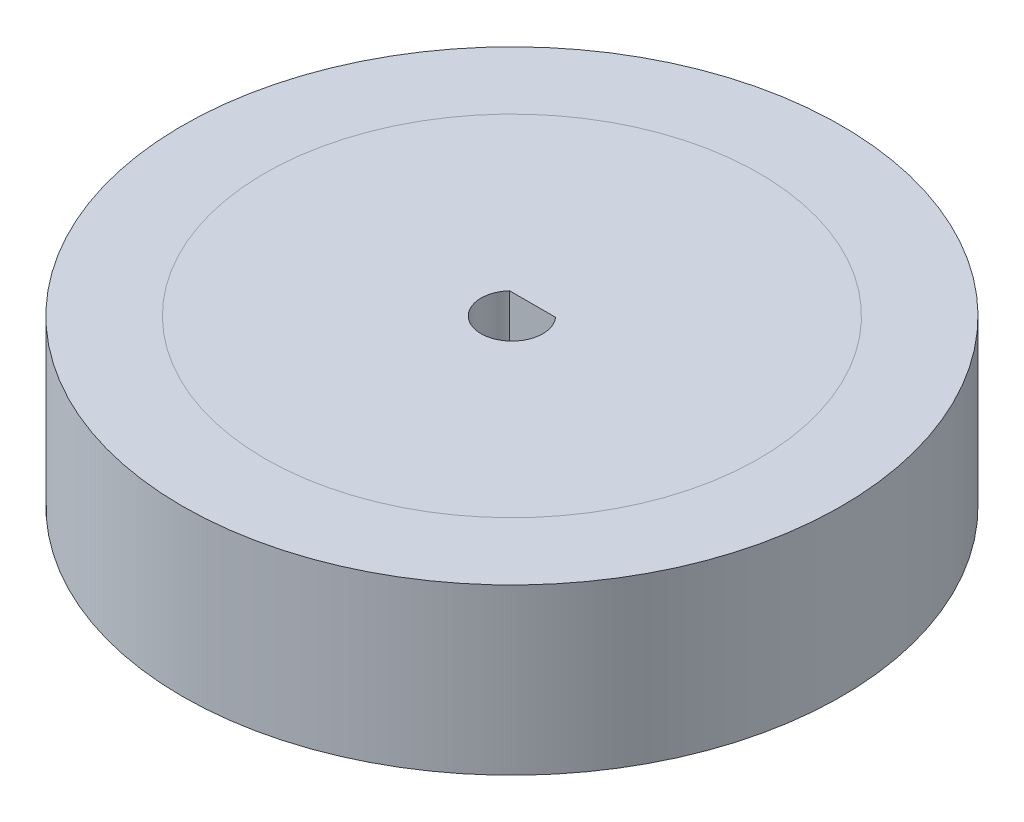
ISO-10303-21;
HEADER;
FILE_DESCRIPTION(('STEP AP214'),'2;1');
FILE_NAME('part.step','',(''),(''),'','','');
FILE_SCHEMA(('AUTOMOTIVE_DESIGN { 1 0 10303 214 1 1 1 1 }'));
ENDSEC;
DATA;
#1=APPLICATION_CONTEXT('core data for automotive mechanical design processes');
#2=APPLICATION_PROTOCOL_DEFINITION('international standard','automotive_design',2000,#1);
#3=PRODUCT_CONTEXT('',#1,'mechanical');
#4=PRODUCT('Part','Part','',(#3));
#5=PRODUCT_RELATED_PRODUCT_CATEGORY('part','',(#4));
#6=PRODUCT_DEFINITION_FORMATION('','',#4);
#7=PRODUCT_DEFINITION_CONTEXT('part definition',#1,'design');
#8=PRODUCT_DEFINITION('design','',#6,#7);
#9=PRODUCT_DEFINITION_SHAPE('','',#8);
#10=(LENGTH_UNIT() NAMED_UNIT(*) SI_UNIT(.MILLI.,.METRE.));
#11=(NAMED_UNIT(*) PLANE_ANGLE_UNIT() SI_UNIT($,.RADIAN.));
#12=(NAMED_UNIT(*) SI_UNIT($,.STERADIAN.) SOLID_ANGLE_UNIT());
#13=UNCERTAINTY_MEASURE_WITH_UNIT(LENGTH_MEASURE(1.E-05),#10,'distance_accuracy_value','');
#14=(GEOMETRIC_REPRESENTATION_CONTEXT(3) GLOBAL_UNCERTAINTY_ASSIGNED_CONTEXT((#13)) GLOBAL_UNIT_ASSIGNED_CONTEXT((#10,
#11,#12)) REPRESENTATION_CONTEXT('',''));
#15=CARTESIAN_POINT('',(0.,0.,0.));
#16=DIRECTION('',(0.,0.,1.));
#17=DIRECTION('',(1.,0.,0.));
#18=AXIS2_PLACEMENT_3D('',#15,#16,#17);
#19=CARTESIAN_POINT('',(0.,-45.254833995939,0.));
#20=DIRECTION('',(0.,1.,0.));
#21=DIRECTION('',(0.,0.,1.));
#22=AXIS2_PLACEMENT_3D('',#19,#20,#21);
#23=CYLINDRICAL_SURFACE('',#22,16.);
#24=CARTESIAN_POINT('',(0.,0.,0.));
#25=DIRECTION('',(0.,1.,0.));
#26=DIRECTION('',(0.,0.,1.));
#27=AXIS2_PLACEMENT_3D('',#24,#25,#26);
#28=CIRCLE('',#27,16.);
#29=CARTESIAN_POINT('',(0.,0.,16.));
#30=VERTEX_POINT('',#29);
#31=EDGE_CURVE('E11',#30,#30,#28,.F.);
#32=CARTESIAN_POINT('',(0.,8.,0.));
#33=DIRECTION('',(0.,1.,0.));
#34=DIRECTION('',(0.,0.,1.));
#35=AXIS2_PLACEMENT_3D('',#32,#33,#34);
#36=CIRCLE('',#35,16.);
#37=CARTESIAN_POINT('',(0.,7.99999999999999,16.));
#38=VERTEX_POINT('',#37);
#39=EDGE_CURVE('E60',#38,#38,#36,.T.);
#40=CARTESIAN_POINT('',(0.,0.,16.));
#41=CARTESIAN_POINT('',(0.,0.0833333333333333,16.));
#42=CARTESIAN_POINT('',(0.,0.166666666666667,16.));
#43=CARTESIAN_POINT('',(0.,0.333333333333334,16.));
#44=CARTESIAN_POINT('',(0.,0.416666666666667,16.));
#45=CARTESIAN_POINT('',(0.,0.583333333333334,16.));
#46=CARTESIAN_POINT('',(0.,0.666666666666667,16.));
#47=CARTESIAN_POINT('',(0.,0.833333333333334,16.));
#48=CARTESIAN_POINT('',(0.,0.916666666666668,16.));
#49=CARTESIAN_POINT('',(0.,1.08333333333333,16.));
#50=CARTESIAN_POINT('',(0.,1.16666666666667,16.));
#51=CARTESIAN_POINT('',(0.,1.33333333333333,16.));
#52=CARTESIAN_POINT('',(0.,1.41666666666667,16.));
#53=CARTESIAN_POINT('',(0.,1.58333333333333,16.));
#54=CARTESIAN_POINT('',(0.,1.66666666666667,16.));
#55=CARTESIAN_POINT('',(0.,1.83333333333334,16.));
#56=CARTESIAN_POINT('',(0.,1.91666666666667,16.));
#57=CARTESIAN_POINT('',(0.,2.08333333333333,16.));
#58=CARTESIAN_POINT('',(0.,2.16666666666666,16.));
#59=CARTESIAN_POINT('',(0.,2.33333333333333,16.));
#60=CARTESIAN_POINT('',(0.,2.41666666666666,16.));
#61=CARTESIAN_POINT('',(0.,2.58333333333333,16.));
#62=CARTESIAN_POINT('',(0.,2.66666666666666,16.));
#63=CARTESIAN_POINT('',(0.,2.83333333333333,16.));
#64=CARTESIAN_POINT('',(0.,2.91666666666666,16.));
#65=CARTESIAN_POINT('',(0.,3.08333333333333,16.));
#66=CARTESIAN_POINT('',(0.,3.16666666666666,16.));
#67=CARTESIAN_POINT('',(0.,3.33333333333333,16.));
#68=CARTESIAN_POINT('',(0.,3.41666666666666,16.));
#69=CARTESIAN_POINT('',(0.,3.58333333333333,16.));
#70=CARTESIAN_POINT('',(0.,3.66666666666666,16.));
#71=CARTESIAN_POINT('',(0.,3.83333333333333,16.));
#72=CARTESIAN_POINT('',(0.,3.91666666666666,16.));
#73=CARTESIAN_POINT('',(0.,4.08333333333333,16.));
#74=CARTESIAN_POINT('',(0.,4.16666666666666,16.));
#75=CARTESIAN_POINT('',(0.,4.33333333333333,16.));
#76=CARTESIAN_POINT('',(0.,4.41666666666666,16.));
#77=CARTESIAN_POINT('',(0.,4.58333333333333,16.));
#78=CARTESIAN_POINT('',(0.,4.66666666666666,16.));
#79=CARTESIAN_POINT('',(0.,4.83333333333333,16.));
#80=CARTESIAN_POINT('',(0.,4.91666666666666,16.));
#81=CARTESIAN_POINT('',(0.,5.08333333333333,16.));
#82=CARTESIAN_POINT('',(0.,5.16666666666666,16.));
#83=CARTESIAN_POINT('',(0.,5.33333333333333,16.));
#84=CARTESIAN_POINT('',(0.,5.41666666666666,16.));
#85=CARTESIAN_POINT('',(0.,5.58333333333333,16.));
#86=CARTESIAN_POINT('',(0.,5.66666666666666,16.));
#87=CARTESIAN_POINT('',(0.,5.83333333333333,16.));
#88=CARTESIAN_POINT('',(0.,5.91666666666666,16.));
#89=CARTESIAN_POINT('',(0.,6.08333333333333,16.));
#90=CARTESIAN_POINT('',(0.,6.16666666666666,16.));
#91=CARTESIAN_POINT('',(0.,6.33333333333333,16.));
#92=CARTESIAN_POINT('',(0.,6.41666666666666,16.));
#93=CARTESIAN_POINT('',(0.,6.58333333333333,16.));
#94=CARTESIAN_POINT('',(0.,6.66666666666666,16.));
#95=CARTESIAN_POINT('',(0.,6.83333333333333,16.));
#96=CARTESIAN_POINT('',(0.,6.91666666666666,16.));
#97=CARTESIAN_POINT('',(0.,7.08333333333333,16.));
#98=CARTESIAN_POINT('',(0.,7.16666666666666,16.));
#99=CARTESIAN_POINT('',(0.,7.33333333333333,16.));
#100=CARTESIAN_POINT('',(0.,7.41666666666666,16.));
#101=CARTESIAN_POINT('',(0.,7.58333333333333,16.));
#102=CARTESIAN_POINT('',(0.,7.66666666666666,16.));
#103=CARTESIAN_POINT('',(0.,7.83333333333333,16.));
#104=CARTESIAN_POINT('',(0.,7.91666666666666,16.));
#105=CARTESIAN_POINT('',(0.,7.99999999999999,16.));
#106=B_SPLINE_CURVE_WITH_KNOTS('',3,(#40,#41,#42,#43,#44,#45,#46,#47,#48,#49,#50,#51,#52,#53,
#54,#55,#56,#57,#58,#59,#60,#61,#62,#63,#64,#65,#66,#67,#68,#69,#70,#71,#72,#73,#74,#75,#76,#77,
#78,#79,#80,#81,#82,#83,#84,#85,#86,#87,#88,#89,#90,#91,#92,#93,#94,#95,#96,#97,#98,#99,#100,
#101,#102,#103,#104,#105),.UNSPECIFIED.,.F.,.F.,(4,2,2,2,2,2,2,2,2,2,2,2,2,2,2,2,2,2,2,2,2,2,2,
2,2,2,2,2,2,2,2,2,4),(0.,0.25,0.5,0.750000000000001,1.,1.25,1.5,1.75,2.,2.25,2.5,2.75,3.,3.25,
3.5,3.75,4.,4.25,4.5,4.75,5.,5.25,5.5,5.74999999999999,5.99999999999999,6.24999999999999,
6.49999999999999,6.74999999999999,6.99999999999999,7.24999999999999,7.49999999999999,
7.74999999999999,7.99999999999999),.UNSPECIFIED.);
#107=EDGE_CURVE('BSEAM49',#30,#38,#106,.T.);
#108=ORIENTED_EDGE('',*,*,#31,.F.);
#109=ORIENTED_EDGE('',*,*,#39,.F.);
#110=ORIENTED_EDGE('',*,*,#107,.T.);
#111=ORIENTED_EDGE('',*,*,#107,.F.);
#112=EDGE_LOOP('',(#108,#110,#109,#111));
#113=FACE_BOUND('',#112,.T.);
#114=ADVANCED_FACE('F49',(#113),#23,.T.);
#115=CARTESIAN_POINT('',(0.,8.,0.));
#116=DIRECTION('',(0.,1.,0.));
#117=DIRECTION('',(0.,0.,1.));
#118=AXIS2_PLACEMENT_3D('',#115,#116,#117);
#119=PLANE('',#118);
#120=CARTESIAN_POINT('',(0.,8.,0.));
#121=DIRECTION('',(0.,1.,0.));
#122=DIRECTION('',(0.,0.,1.));
#123=AXIS2_PLACEMENT_3D('',#120,#121,#122);
#124=CIRCLE('',#123,12.);
#125=CARTESIAN_POINT('',(0.,7.99999999999999,12.));
#126=VERTEX_POINT('',#125);
#127=EDGE_CURVE('E62',#126,#126,#124,.T.);
#128=ORIENTED_EDGE('',*,*,#127,.F.);
#129=EDGE_LOOP('',(#128));
#130=FACE_BOUND('',#129,.T.);
#131=ORIENTED_EDGE('',*,*,#39,.T.);
#132=EDGE_LOOP('',(#131));
#133=FACE_BOUND('',#132,.T.);
#134=ADVANCED_FACE('F67',(#130,#133),#119,.T.);
#135=CARTESIAN_POINT('',(0.,-45.254833995939,0.));
#136=DIRECTION('',(0.,1.,0.));
#137=DIRECTION('',(0.,0.,1.));
#138=AXIS2_PLACEMENT_3D('',#135,#136,#137);
#139=CYLINDRICAL_SURFACE('',#138,12.);
#140=CARTESIAN_POINT('',(0.,0.,0.));
#141=DIRECTION('',(0.,1.,0.));
#142=DIRECTION('',(0.,0.,1.));
#143=AXIS2_PLACEMENT_3D('',#140,#141,#142);
#144=CIRCLE('',#143,12.);
#145=CARTESIAN_POINT('',(0.,0.,12.));
#146=VERTEX_POINT('',#145);
#147=EDGE_CURVE('E52',#146,#146,#144,.F.);
#148=CARTESIAN_POINT('',(0.,0.,12.));
#149=CARTESIAN_POINT('',(0.,0.0833333333333333,12.));
#150=CARTESIAN_POINT('',(0.,0.166666666666667,12.));
#151=CARTESIAN_POINT('',(0.,0.333333333333334,12.));
#152=CARTESIAN_POINT('',(0.,0.416666666666667,12.));
#153=CARTESIAN_POINT('',(0.,0.583333333333334,12.));
#154=CARTESIAN_POINT('',(0.,0.666666666666667,12.));
#155=CARTESIAN_POINT('',(0.,0.833333333333334,12.));
#156=CARTESIAN_POINT('',(0.,0.916666666666668,12.));
#157=CARTESIAN_POINT('',(0.,1.08333333333333,12.));
#158=CARTESIAN_POINT('',(0.,1.16666666666667,12.));
#159=CARTESIAN_POINT('',(0.,1.33333333333333,12.));
#160=CARTESIAN_POINT('',(0.,1.41666666666667,12.));
#161=CARTESIAN_POINT('',(0.,1.58333333333333,12.));
#162=CARTESIAN_POINT('',(0.,1.66666666666667,12.));
#163=CARTESIAN_POINT('',(0.,1.83333333333334,12.));
#164=CARTESIAN_POINT('',(0.,1.91666666666667,12.));
#165=CARTESIAN_POINT('',(0.,2.08333333333333,12.));
#166=CARTESIAN_POINT('',(0.,2.16666666666666,12.));
#167=CARTESIAN_POINT('',(0.,2.33333333333333,12.));
#168=CARTESIAN_POINT('',(0.,2.41666666666666,12.));
#169=CARTESIAN_POINT('',(0.,2.58333333333333,12.));
#170=CARTESIAN_POINT('',(0.,2.66666666666666,12.));
#171=CARTESIAN_POINT('',(0.,2.83333333333333,12.));
#172=CARTESIAN_POINT('',(0.,2.91666666666666,12.));
#173=CARTESIAN_POINT('',(0.,3.08333333333333,12.));
#174=CARTESIAN_POINT('',(0.,3.16666666666666,12.));
#175=CARTESIAN_POINT('',(0.,3.33333333333333,12.));
#176=CARTESIAN_POINT('',(0.,3.41666666666666,12.));
#177=CARTESIAN_POINT('',(0.,3.58333333333333,12.));
#178=CARTESIAN_POINT('',(0.,3.66666666666666,12.));
#179=CARTESIAN_POINT('',(0.,3.83333333333333,12.));
#180=CARTESIAN_POINT('',(0.,3.91666666666666,12.));
#181=CARTESIAN_POINT('',(0.,4.08333333333333,12.));
#182=CARTESIAN_POINT('',(0.,4.16666666666666,12.));
#183=CARTESIAN_POINT('',(0.,4.33333333333333,12.));
#184=CARTESIAN_POINT('',(0.,4.41666666666666,12.));
#185=CARTESIAN_POINT('',(0.,4.58333333333333,12.));
#186=CARTESIAN_POINT('',(0.,4.66666666666666,12.));
#187=CARTESIAN_POINT('',(0.,4.83333333333333,12.));
#188=CARTESIAN_POINT('',(0.,4.91666666666666,12.));
#189=CARTESIAN_POINT('',(0.,5.08333333333333,12.));
#190=CARTESIAN_POINT('',(0.,5.16666666666666,12.));
#191=CARTESIAN_POINT('',(0.,5.33333333333333,12.));
#192=CARTESIAN_POINT('',(0.,5.41666666666666,12.));
#193=CARTESIAN_POINT('',(0.,5.58333333333333,12.));
#194=CARTESIAN_POINT('',(0.,5.66666666666666,12.));
#195=CARTESIAN_POINT('',(0.,5.83333333333333,12.));
#196=CARTESIAN_POINT('',(0.,5.91666666666666,12.));
#197=CARTESIAN_POINT('',(0.,6.08333333333333,12.));
#198=CARTESIAN_POINT('',(0.,6.16666666666666,12.));
#199=CARTESIAN_POINT('',(0.,6.33333333333333,12.));
#200=CARTESIAN_POINT('',(0.,6.41666666666666,12.));
#201=CARTESIAN_POINT('',(0.,6.58333333333333,12.));
#202=CARTESIAN_POINT('',(0.,6.66666666666666,12.));
#203=CARTESIAN_POINT('',(0.,6.83333333333333,12.));
#204=CARTESIAN_POINT('',(0.,6.91666666666666,12.));
#205=CARTESIAN_POINT('',(0.,7.08333333333333,12.));
#206=CARTESIAN_POINT('',(0.,7.16666666666666,12.));
#207=CARTESIAN_POINT('',(0.,7.33333333333333,12.));
#208=CARTESIAN_POINT('',(0.,7.41666666666666,12.));
#209=CARTESIAN_POINT('',(0.,7.58333333333333,12.));
#210=CARTESIAN_POINT('',(0.,7.66666666666666,12.));
#211=CARTESIAN_POINT('',(0.,7.83333333333333,12.));
#212=CARTESIAN_POINT('',(0.,7.91666666666666,12.));
#213=CARTESIAN_POINT('',(0.,7.99999999999999,12.));
#214=B_SPLINE_CURVE_WITH_KNOTS('',3,(#148,#149,#150,#151,#152,#153,#154,#155,#156,#157,#158,
#159,#160,#161,#162,#163,#164,#165,#166,#167,#168,#169,#170,#171,#172,#173,#174,#175,#176,#177,
#178,#179,#180,#181,#182,#183,#184,#185,#186,#187,#188,#189,#190,#191,#192,#193,#194,#195,#196,
#197,#198,#199,#200,#201,#202,#203,#204,#205,#206,#207,#208,#209,#210,#211,#212,#213),
.UNSPECIFIED.,.F.,.F.,(4,2,2,2,2,2,2,2,2,2,2,2,2,2,2,2,2,2,2,2,2,2,2,2,2,2,2,2,2,2,2,2,4),(0.,
0.25,0.5,0.750000000000001,1.,1.25,1.5,1.75,2.,2.25,2.5,2.75,3.,3.25,3.5,3.75,4.,4.25,4.5,4.75,
5.,5.25,5.5,5.74999999999999,5.99999999999999,6.24999999999999,6.49999999999999,
6.74999999999999,6.99999999999999,7.24999999999999,7.49999999999999,7.74999999999999,
7.99999999999999),.UNSPECIFIED.);
#215=EDGE_CURVE('BSEAM74',#146,#126,#214,.T.);
#216=ORIENTED_EDGE('',*,*,#147,.T.);
#217=ORIENTED_EDGE('',*,*,#127,.T.);
#218=ORIENTED_EDGE('',*,*,#215,.T.);
#219=ORIENTED_EDGE('',*,*,#215,.F.);
#220=EDGE_LOOP('',(#216,#218,#217,#219));
#221=FACE_BOUND('',#220,.T.);
#222=ADVANCED_FACE('F74',(#221),#139,.F.);
#223=CARTESIAN_POINT('',(0.,0.,0.));
#224=DIRECTION('',(0.,1.,0.));
#225=DIRECTION('',(0.,0.,1.));
#226=AXIS2_PLACEMENT_3D('',#223,#224,#225);
#227=PLANE('',#226);
#228=ORIENTED_EDGE('',*,*,#31,.T.);
#229=EDGE_LOOP('',(#228));
#230=FACE_BOUND('',#229,.T.);
#231=ORIENTED_EDGE('',*,*,#147,.F.);
#232=EDGE_LOOP('',(#231));
#233=FACE_BOUND('',#232,.T.);
#234=ADVANCED_FACE('F79',(#230,#233),#227,.F.);
#235=CLOSED_SHELL('',(#114,#134,#222,#234));
#236=MANIFOLD_SOLID_BREP('B2',#235);
#237=CARTESIAN_POINT('',(0.,8.,0.));
#238=DIRECTION('',(0.,1.,0.));
#239=DIRECTION('',(0.,0.,1.));
#240=AXIS2_PLACEMENT_3D('',#237,#238,#239);
#241=PLANE('',#240);
#242=CARTESIAN_POINT('',(0.,8.,0.));
#243=DIRECTION('',(0.,1.,0.));
#244=DIRECTION('',(0.,0.,1.));
#245=AXIS2_PLACEMENT_3D('',#242,#243,#244);
#246=CIRCLE('',#245,12.);
#247=CARTESIAN_POINT('',(0.,8.,12.));
#248=VERTEX_POINT('',#247);
#249=EDGE_CURVE('E47',#248,#248,#246,.T.);
#250=ORIENTED_EDGE('',*,*,#249,.T.);
#251=EDGE_LOOP('',(#250));
#252=FACE_BOUND('',#251,.T.);
#253=DIRECTION('',(-1.,0.,0.));
#254=VECTOR('',#253,1.);
#255=CARTESIAN_POINT('',(-1.11803398874989,8.,-1.));
#256=LINE('',#255,#254);
#257=CARTESIAN_POINT('',(1.11803398874989,8.,-1.));
#258=VERTEX_POINT('',#257);
#259=CARTESIAN_POINT('',(-1.11803398874989,8.,-1.));
#260=VERTEX_POINT('',#259);
#261=EDGE_CURVE('E160',#258,#260,#256,.T.);
#262=ORIENTED_EDGE('',*,*,#261,.F.);
#263=CARTESIAN_POINT('',(0.,8.,0.));
#264=DIRECTION('',(0.,1.,0.));
#265=DIRECTION('',(0.,0.,1.));
#266=AXIS2_PLACEMENT_3D('',#263,#264,#265);
#267=CIRCLE('',#266,1.5);
#268=EDGE_CURVE('E151',#260,#258,#267,.T.);
#269=ORIENTED_EDGE('',*,*,#268,.F.);
#270=EDGE_LOOP('',(#262,#269));
#271=FACE_BOUND('',#270,.T.);
#272=ADVANCED_FACE('F119',(#252,#271),#241,.T.);
#273=CARTESIAN_POINT('',(0.,0.,0.));
#274=DIRECTION('',(0.,1.,0.));
#275=DIRECTION('',(0.,0.,1.));
#276=AXIS2_PLACEMENT_3D('',#273,#274,#275);
#277=PLANE('',#276);
#278=CARTESIAN_POINT('',(0.,0.,0.));
#279=DIRECTION('',(0.,1.,0.));
#280=DIRECTION('',(0.,0.,1.));
#281=AXIS2_PLACEMENT_3D('',#278,#279,#280);
#282=CIRCLE('',#281,12.);
#283=CARTESIAN_POINT('',(0.,0.,12.));
#284=VERTEX_POINT('',#283);
#285=EDGE_CURVE('E123',#284,#284,#282,.T.);
#286=ORIENTED_EDGE('',*,*,#285,.F.);
#287=EDGE_LOOP('',(#286));
#288=FACE_BOUND('',#287,.T.);
#289=CARTESIAN_POINT('',(0.,0.,0.));
#290=DIRECTION('',(0.,1.,0.));
#291=DIRECTION('',(0.,0.,1.));
#292=AXIS2_PLACEMENT_3D('',#289,#290,#291);
#293=CIRCLE('',#292,1.5);
#294=CARTESIAN_POINT('',(-1.11803398874989,0.,-1.));
#295=VERTEX_POINT('',#294);
#296=CARTESIAN_POINT('',(1.11803398874989,0.,-1.));
#297=VERTEX_POINT('',#296);
#298=EDGE_CURVE('E141',#295,#297,#293,.T.);
#299=ORIENTED_EDGE('',*,*,#298,.T.);
#300=DIRECTION('',(-1.,0.,0.));
#301=VECTOR('',#300,1.);
#302=CARTESIAN_POINT('',(-1.11803398874989,0.,-1.));
#303=LINE('',#302,#301);
#304=EDGE_CURVE('E147',#297,#295,#303,.T.);
#305=ORIENTED_EDGE('',*,*,#304,.T.);
#306=EDGE_LOOP('',(#299,#305));
#307=FACE_BOUND('',#306,.T.);
#308=ADVANCED_FACE('F157',(#288,#307),#277,.F.);
#309=CARTESIAN_POINT('',(0.,8.,0.));
#310=DIRECTION('',(0.,-1.,0.));
#311=DIRECTION('',(0.,0.,-1.));
#312=AXIS2_PLACEMENT_3D('',#309,#310,#311);
#313=CYLINDRICAL_SURFACE('',#312,12.);
#314=ORIENTED_EDGE('',*,*,#249,.F.);
#315=EDGE_LOOP('',(#314));
#316=FACE_BOUND('',#315,.T.);
#317=ORIENTED_EDGE('',*,*,#285,.T.);
#318=EDGE_LOOP('',(#317));
#319=FACE_BOUND('',#318,.T.);
#320=ADVANCED_FACE('F121',(#316,#319),#313,.T.);
#321=CARTESIAN_POINT('',(0.,8.,0.));
#322=DIRECTION('',(0.,-1.,0.));
#323=DIRECTION('',(0.,0.,-1.));
#324=AXIS2_PLACEMENT_3D('',#321,#322,#323);
#325=CYLINDRICAL_SURFACE('',#324,1.5);
#326=ORIENTED_EDGE('',*,*,#298,.F.);
#327=DIRECTION('',(0.,-1.,0.));
#328=VECTOR('',#327,1.);
#329=CARTESIAN_POINT('',(-1.11803398874989,8.,-1.));
#330=LINE('',#329,#328);
#331=EDGE_CURVE('E149',#260,#295,#330,.T.);
#332=ORIENTED_EDGE('',*,*,#331,.F.);
#333=ORIENTED_EDGE('',*,*,#268,.T.);
#334=DIRECTION('',(0.,-1.,0.));
#335=VECTOR('',#334,1.);
#336=CARTESIAN_POINT('',(1.11803398874989,8.,-1.));
#337=LINE('',#336,#335);
#338=EDGE_CURVE('E134',#258,#297,#337,.T.);
#339=ORIENTED_EDGE('',*,*,#338,.T.);
#340=EDGE_LOOP('',(#326,#332,#333,#339));
#341=FACE_BOUND('',#340,.T.);
#342=ADVANCED_FACE('F153',(#341),#325,.F.);
#343=CARTESIAN_POINT('',(-1.11803398874989,8.,-1.));
#344=DIRECTION('',(0.,0.,1.));
#345=DIRECTION('',(1.,0.,0.));
#346=AXIS2_PLACEMENT_3D('',#343,#344,#345);
#347=PLANE('',#346);
#348=ORIENTED_EDGE('',*,*,#304,.F.);
#349=ORIENTED_EDGE('',*,*,#338,.F.);
#350=ORIENTED_EDGE('',*,*,#261,.T.);
#351=ORIENTED_EDGE('',*,*,#331,.T.);
#352=EDGE_LOOP('',(#348,#349,#350,#351));
#353=FACE_BOUND('',#352,.T.);
#354=ADVANCED_FACE('F148',(#353),#347,.T.);
#355=CLOSED_SHELL('',(#272,#308,#320,#342,#354));
#356=MANIFOLD_SOLID_BREP('B6',#355);
#357=ADVANCED_BREP_SHAPE_REPRESENTATION('',(#18,#236,#356),#14);
#358=SHAPE_DEFINITION_REPRESENTATION(#9,#357);
ENDSEC;
END-ISO-10303-21;
